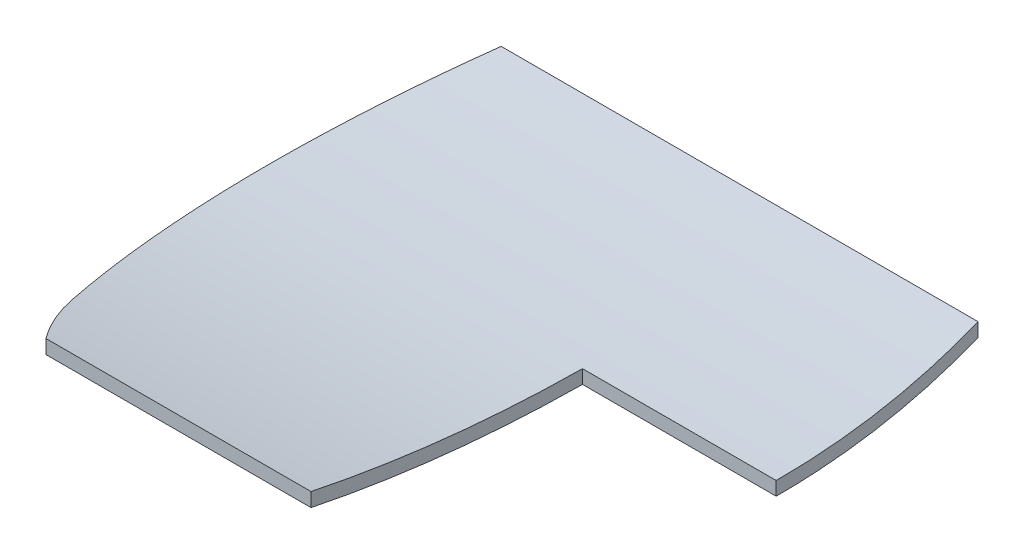
ISO-10303-21;
HEADER;
FILE_DESCRIPTION(('STEP AP214'),'2;1');
FILE_NAME('part.step','',(''),(''),'','','');
FILE_SCHEMA(('AUTOMOTIVE_DESIGN { 1 0 10303 214 1 1 1 1 }'));
ENDSEC;
DATA;
#1=APPLICATION_CONTEXT('core data for automotive mechanical design processes');
#2=APPLICATION_PROTOCOL_DEFINITION('international standard','automotive_design',2000,#1);
#3=PRODUCT_CONTEXT('',#1,'mechanical');
#4=PRODUCT('Part','Part','',(#3));
#5=PRODUCT_RELATED_PRODUCT_CATEGORY('part','',(#4));
#6=PRODUCT_DEFINITION_FORMATION('','',#4);
#7=PRODUCT_DEFINITION_CONTEXT('part definition',#1,'design');
#8=PRODUCT_DEFINITION('design','',#6,#7);
#9=PRODUCT_DEFINITION_SHAPE('','',#8);
#10=(LENGTH_UNIT() NAMED_UNIT(*) SI_UNIT(.MILLI.,.METRE.));
#11=(NAMED_UNIT(*) PLANE_ANGLE_UNIT() SI_UNIT($,.RADIAN.));
#12=(NAMED_UNIT(*) SI_UNIT($,.STERADIAN.) SOLID_ANGLE_UNIT());
#13=UNCERTAINTY_MEASURE_WITH_UNIT(LENGTH_MEASURE(1.E-05),#10,'distance_accuracy_value','');
#14=(GEOMETRIC_REPRESENTATION_CONTEXT(3) GLOBAL_UNCERTAINTY_ASSIGNED_CONTEXT((#13)) GLOBAL_UNIT_ASSIGNED_CONTEXT((#10,
#11,#12)) REPRESENTATION_CONTEXT('',''));
#15=CARTESIAN_POINT('',(0.,0.,0.));
#16=DIRECTION('',(0.,0.,1.));
#17=DIRECTION('',(1.,0.,0.));
#18=AXIS2_PLACEMENT_3D('',#15,#16,#17);
#19=CARTESIAN_POINT('',(-75.8377425044092,30.,71.3668430335097));
#20=DIRECTION('',(0.,0.,-1.));
#21=DIRECTION('',(-1.,0.,0.));
#22=AXIS2_PLACEMENT_3D('',#19,#20,#21);
#23=PLANE('',#22);
#24=DIRECTION('',(-1.,0.,0.));
#25=VECTOR('',#24,1.);
#26=CARTESIAN_POINT('',(20.7883417998944,4.41216156979368,71.3668430335097));
#27=LINE('',#26,#25);
#28=CARTESIAN_POINT('',(-25.2116582001055,4.41216156979368,71.3668430335097));
#29=VERTEX_POINT('',#28);
#30=CARTESIAN_POINT('',(-65.4037646343129,4.41216156979371,71.3668430335097));
#31=VERTEX_POINT('',#30);
#32=EDGE_CURVE('E62',#29,#31,#27,.T.);
#33=ORIENTED_EDGE('',*,*,#32,.F.);
#34=DIRECTION('',(0.,1.,0.));
#35=VECTOR('',#34,1.);
#36=CARTESIAN_POINT('',(-25.2116582001056,0.,71.3668430335097));
#37=LINE('',#36,#35);
#38=CARTESIAN_POINT('',(-25.2116582001055,6.52577837510951,71.3668430335097));
#39=VERTEX_POINT('',#38);
#40=EDGE_CURVE('E119',#29,#39,#37,.T.);
#41=ORIENTED_EDGE('',*,*,#40,.T.);
#42=DIRECTION('',(-1.,0.,0.));
#43=VECTOR('',#42,1.);
#44=CARTESIAN_POINT('',(20.7883417998944,6.52577837510951,71.3668430335097));
#45=LINE('',#44,#43);
#46=CARTESIAN_POINT('',(-65.4037646343129,6.52577837510951,71.3668430335097));
#47=VERTEX_POINT('',#46);
#48=EDGE_CURVE('E103',#39,#47,#45,.T.);
#49=ORIENTED_EDGE('',*,*,#48,.T.);
#50=DIRECTION('',(0.,1.,0.));
#51=VECTOR('',#50,1.);
#52=CARTESIAN_POINT('',(-65.4037646343129,0.,71.3668430335097));
#53=LINE('',#52,#51);
#54=EDGE_CURVE('E126',#31,#47,#53,.T.);
#55=ORIENTED_EDGE('',*,*,#54,.F.);
#56=EDGE_LOOP('',(#33,#41,#49,#55));
#57=FACE_BOUND('',#56,.T.);
#58=ADVANCED_FACE('F41',(#57),#23,.F.);
#59=CARTESIAN_POINT('',(-75.8377425044092,30.,-3.6331569664903));
#60=DIRECTION('',(0.,0.,1.));
#61=DIRECTION('',(1.,0.,0.));
#62=AXIS2_PLACEMENT_3D('',#59,#60,#61);
#63=PLANE('',#62);
#64=DIRECTION('',(-1.,0.,0.));
#65=VECTOR('',#64,1.);
#66=CARTESIAN_POINT('',(20.7883417998944,4.41216156979371,-3.6331569664903));
#67=LINE('',#66,#65);
#68=CARTESIAN_POINT('',(0.934093700573107,4.41216156979371,-3.6331569664903));
#69=VERTEX_POINT('',#68);
#70=CARTESIAN_POINT('',(-71.375833468403,4.41216156979371,-3.63315696649029));
#71=VERTEX_POINT('',#70);
#72=EDGE_CURVE('E173',#69,#71,#67,.T.);
#73=ORIENTED_EDGE('',*,*,#72,.F.);
#74=DIRECTION('',(0.,1.,0.));
#75=VECTOR('',#74,1.);
#76=CARTESIAN_POINT('',(0.934093700573027,0.,-3.6331569664903));
#77=LINE('',#76,#75);
#78=CARTESIAN_POINT('',(0.934093700573013,2.31945288912139,-3.6331569664903));
#79=VERTEX_POINT('',#78);
#80=EDGE_CURVE('E139',#79,#69,#77,.T.);
#81=ORIENTED_EDGE('',*,*,#80,.F.);
#82=DIRECTION('',(-1.,0.,0.));
#83=VECTOR('',#82,1.);
#84=CARTESIAN_POINT('',(20.7883417998944,2.31945288912139,-3.63315696649031));
#85=LINE('',#84,#83);
#86=CARTESIAN_POINT('',(-71.375833468403,2.31945288912139,-3.63315696649029));
#87=VERTEX_POINT('',#86);
#88=EDGE_CURVE('E214',#79,#87,#85,.T.);
#89=ORIENTED_EDGE('',*,*,#88,.T.);
#90=DIRECTION('',(0.,1.,0.));
#91=VECTOR('',#90,1.);
#92=CARTESIAN_POINT('',(-71.375833468403,0.,-3.6331569664903));
#93=LINE('',#92,#91);
#94=EDGE_CURVE('E143',#87,#71,#93,.T.);
#95=ORIENTED_EDGE('',*,*,#94,.T.);
#96=EDGE_LOOP('',(#73,#81,#89,#95));
#97=FACE_BOUND('',#96,.T.);
#98=ADVANCED_FACE('F189',(#97),#63,.F.);
#99=CARTESIAN_POINT('',(-192.882196536429,0.,31.9303002667312));
#100=DIRECTION('',(0.,1.,0.));
#101=DIRECTION('',(0.,0.,1.));
#102=AXIS2_PLACEMENT_3D('',#99,#100,#101);
#103=CYLINDRICAL_SURFACE('',#102,197.052058734775);
#104=CARTESIAN_POINT('',(4.16225749559082,2.08200439865197,30.1991195031464));
#105=CARTESIAN_POINT('',(4.1497500521118,2.06690595253031,28.7742096374881));
#106=CARTESIAN_POINT('',(4.12176267635813,2.06607037796173,27.3492867007925));
#107=CARTESIAN_POINT('',(4.0349017722859,2.09283816336801,24.5006582465492));
#108=CARTESIAN_POINT('',(3.97602843414067,2.12044134823864,23.0769527215596));
#109=CARTESIAN_POINT('',(3.827719864576,2.20385865025037,20.2367861368775));
#110=CARTESIAN_POINT('',(3.73838845405387,2.25957723749714,18.8203168443086));
#111=CARTESIAN_POINT('',(3.52927211708455,2.39900919013379,15.9910114980162));
#112=CARTESIAN_POINT('',(3.40948722092667,2.48272252767988,14.5781754406804));
#113=CARTESIAN_POINT('',(3.13967307331135,2.67791962083178,11.757350130364));
#114=CARTESIAN_POINT('',(2.98964445851893,2.78940279186235,10.3493607759891));
#115=CARTESIAN_POINT('',(2.6596063165774,3.03985766837566,7.53934817011896));
#116=CARTESIAN_POINT('',(2.47959663413071,3.17882951624645,6.13732494956595));
#117=CARTESIAN_POINT('',(2.08925251778527,3.48444320566137,3.33563505731731));
#118=CARTESIAN_POINT('',(1.87881732558479,3.65117727535941,1.93599249714563));
#119=CARTESIAN_POINT('',(1.42846854166668,4.01157419255261,-0.855038770162124));
#120=CARTESIAN_POINT('',(1.18855538971274,4.20523663832542,-2.24642760010603));
#121=CARTESIAN_POINT('',(0.934093700573018,4.4121615697937,-3.6331569664903));
#122=B_SPLINE_CURVE_WITH_KNOTS('',3,(#104,#105,#106,#107,#108,#109,#110,#111,#112,#113,#114,
#115,#116,#117,#118,#119,#120,#121),.UNSPECIFIED.,.F.,.F.,(4,2,2,2,2,2,2,2,4),(0.,
4.27497605719888,8.54992579250758,12.8104470334673,17.0709640368935,21.3313913609072,
25.5918407540015,29.8667368888206,34.141569256814),.UNSPECIFIED.);
#123=CARTESIAN_POINT('',(4.16225749559082,2.082004398652,30.1991195031464));
#124=VERTEX_POINT('',#123);
#125=EDGE_CURVE('E146',#124,#69,#122,.T.);
#126=ORIENTED_EDGE('',*,*,#125,.F.);
#127=DIRECTION('',(0.,1.,0.));
#128=VECTOR('',#127,1.);
#129=CARTESIAN_POINT('',(4.16225749559082,0.,30.1991195031464));
#130=LINE('',#129,#128);
#131=CARTESIAN_POINT('',(4.16225749559082,0.0118739380604582,30.1991195031464));
#132=VERTEX_POINT('',#131);
#133=EDGE_CURVE('E132',#132,#124,#130,.T.);
#134=ORIENTED_EDGE('',*,*,#133,.F.);
#135=CARTESIAN_POINT('',(0.934093700573013,2.31945288912136,-3.6331569664903));
#136=CARTESIAN_POINT('',(1.18858752579876,2.11452876182205,-2.24625170457617));
#137=CARTESIAN_POINT('',(1.42852249697442,1.92274020665817,-0.854723428324354));
#138=CARTESIAN_POINT('',(1.87889965158828,1.56583249275251,1.93652175330643));
#139=CARTESIAN_POINT('',(2.08934140335574,1.40071372435155,3.33623877822585));
#140=CARTESIAN_POINT('',(2.47969457155032,1.09805770224319,6.13806205385209));
#141=CARTESIAN_POINT('',(2.65970591159156,0.960429895621489,7.54014458882327));
#142=CARTESIAN_POINT('',(2.98974043348824,0.712398865573475,10.3502295088094));
#143=CARTESIAN_POINT('',(3.13976376780559,0.601995503734775,11.7582318636903));
#144=CARTESIAN_POINT('',(3.40956410916235,0.408690407431087,14.579045776477));
#145=CARTESIAN_POINT('',(3.52934049155992,0.325789240913785,15.9918574330912));
#146=CARTESIAN_POINT('',(3.73843954202594,0.187711180828256,18.821087262448));
#147=CARTESIAN_POINT('',(3.82776218030641,0.132534314378224,20.237505438717));
#148=CARTESIAN_POINT('',(3.97605286331917,0.0499305441751372,23.077511944083));
#149=CARTESIAN_POINT('',(4.0349179916723,0.0225974273916232,24.5011083804206));
#150=CARTESIAN_POINT('',(4.12176708439733,-0.00390721356976788,27.3495131167224));
#151=CARTESIAN_POINT('',(4.14975086228322,-0.00307856768561422,28.7743214239528));
#152=CARTESIAN_POINT('',(4.16225749559082,0.0118739380604467,30.1991195031464));
#153=B_SPLINE_CURVE_WITH_KNOTS('',3,(#135,#136,#137,#138,#139,#140,#141,#142,#143,#144,#145,
#146,#147,#148,#149,#150,#151,#152),.UNSPECIFIED.,.F.,.F.,(4,2,2,2,2,2,2,2,4),(0.,
4.27449659658858,8.54905574933461,12.8092938557696,17.0695103021899,21.3298147208411,
25.5901233066505,29.8647350409818,34.1393725886576),.UNSPECIFIED.);
#154=EDGE_CURVE('E175',#79,#132,#153,.T.);
#155=ORIENTED_EDGE('',*,*,#154,.F.);
#156=ORIENTED_EDGE('',*,*,#80,.T.);
#157=EDGE_LOOP('',(#126,#134,#155,#156));
#158=FACE_BOUND('',#157,.T.);
#159=ADVANCED_FACE('F186',(#158),#103,.T.);
#160=CARTESIAN_POINT('',(4.16225749559083,0.,30.1991195031464));
#161=DIRECTION('',(0.,0.,-1.));
#162=DIRECTION('',(-1.,0.,0.));
#163=AXIS2_PLACEMENT_3D('',#160,#161,#162);
#164=PLANE('',#163);
#165=DIRECTION('',(-1.,0.,0.));
#166=VECTOR('',#165,1.);
#167=CARTESIAN_POINT('',(20.7883417998944,2.082004398652,30.1991195031464));
#168=LINE('',#167,#166);
#169=CARTESIAN_POINT('',(-25.2116582001056,2.08200439865197,30.1991195031464));
#170=VERTEX_POINT('',#169);
#171=EDGE_CURVE('E123',#170,#124,#168,.F.);
#172=ORIENTED_EDGE('',*,*,#171,.F.);
#173=DIRECTION('',(0.,1.,0.));
#174=VECTOR('',#173,1.);
#175=CARTESIAN_POINT('',(-25.2116582001056,0.,30.1991195031464));
#176=LINE('',#175,#174);
#177=CARTESIAN_POINT('',(-25.2116582001056,0.011873938060486,30.1991195031464));
#178=VERTEX_POINT('',#177);
#179=EDGE_CURVE('E121',#178,#170,#176,.T.);
#180=ORIENTED_EDGE('',*,*,#179,.F.);
#181=DIRECTION('',(-1.,0.,0.));
#182=VECTOR('',#181,1.);
#183=CARTESIAN_POINT('',(20.7883417998944,0.011873938060486,30.1991195031464));
#184=LINE('',#183,#182);
#185=EDGE_CURVE('E172',#132,#178,#184,.T.);
#186=ORIENTED_EDGE('',*,*,#185,.F.);
#187=ORIENTED_EDGE('',*,*,#133,.T.);
#188=EDGE_LOOP('',(#172,#180,#186,#187));
#189=FACE_BOUND('',#188,.T.);
#190=ADVANCED_FACE('F231',(#189),#164,.F.);
#191=CARTESIAN_POINT('',(-25.2116582001056,0.,30.1991195031464));
#192=DIRECTION('',(-1.,0.,0.));
#193=DIRECTION('',(0.,0.,1.));
#194=AXIS2_PLACEMENT_3D('',#191,#192,#193);
#195=PLANE('',#194);
#196=CARTESIAN_POINT('',(-25.2116582001056,215.975985985376,27.9344274777523));
#197=DIRECTION('',(-1.,0.,0.));
#198=DIRECTION('',(0.,0.,1.));
#199=AXIS2_PLACEMENT_3D('',#196,#197,#198);
#200=CIRCLE('',#199,213.905970437928);
#201=EDGE_CURVE('E106',#39,#170,#200,.F.);
#202=ORIENTED_EDGE('',*,*,#201,.F.);
#203=ORIENTED_EDGE('',*,*,#40,.F.);
#204=CARTESIAN_POINT('',(-25.2116582001056,215.975985985376,27.9344274777524));
#205=DIRECTION('',(-1.,0.,0.));
#206=DIRECTION('',(0.,0.,1.));
#207=AXIS2_PLACEMENT_3D('',#204,#205,#206);
#208=CIRCLE('',#207,215.975985985376);
#209=EDGE_CURVE('E198',#178,#29,#208,.T.);
#210=ORIENTED_EDGE('',*,*,#209,.F.);
#211=ORIENTED_EDGE('',*,*,#179,.T.);
#212=EDGE_LOOP('',(#202,#203,#210,#211));
#213=FACE_BOUND('',#212,.T.);
#214=ADVANCED_FACE('F117',(#213),#195,.F.);
#215=CARTESIAN_POINT('',(35.3142305767403,0.,27.5436189071597));
#216=DIRECTION('',(0.,1.,0.));
#217=DIRECTION('',(0.,0.,1.));
#218=AXIS2_PLACEMENT_3D('',#215,#216,#217);
#219=CYLINDRICAL_SURFACE('',#218,111.151973081149);
#220=CARTESIAN_POINT('',(-71.375833468403,4.41216156979371,-3.63315696649032));
#221=CARTESIAN_POINT('',(-71.7718356768491,4.20994320359344,-2.27808069271092));
#222=CARTESIAN_POINT('',(-72.1424664584692,4.01970838291034,-0.913773124952403));
#223=CARTESIAN_POINT('',(-72.8321023283764,3.66420253756482,1.83111192000715));
#224=CARTESIAN_POINT('',(-73.1511049672504,3.49893269735006,3.21169016581235));
#225=CARTESIAN_POINT('',(-73.7366101083321,3.19434889302429,5.98701358412026));
#226=CARTESIAN_POINT('',(-74.0031043290898,3.05503902341959,7.38176095491094));
#227=CARTESIAN_POINT('',(-74.4827687540332,2.80323896875314,10.1827769114246));
#228=CARTESIAN_POINT('',(-74.6959400612387,2.69074822892211,11.589045258207));
#229=CARTESIAN_POINT('',(-75.0631319412531,2.49602624168748,14.3712070164451));
#230=CARTESIAN_POINT('',(-75.2186386929934,2.41303740074008,15.7468513926519));
#231=CARTESIAN_POINT('',(-75.4782325013502,2.27352240335241,18.5043181635753));
#232=CARTESIAN_POINT('',(-75.582319846734,2.21699609830079,19.886140523553));
#233=CARTESIAN_POINT('',(-75.7387589126008,2.13073766320849,22.6533400463161));
#234=CARTESIAN_POINT('',(-75.7911183342032,2.10100154477228,24.0387166491553));
#235=CARTESIAN_POINT('',(-75.8439712778178,2.06847573700846,26.8107764298614));
#236=CARTESIAN_POINT('',(-75.8444647610654,2.0656860678206,28.1974596087041));
#237=CARTESIAN_POINT('',(-75.793437504555,2.08711866583166,30.977348478335));
#238=CARTESIAN_POINT('',(-75.7416285096781,2.11149070697851,32.3705477305125));
#239=CARTESIAN_POINT('',(-75.5857072947837,2.18732922066446,35.1532762751625));
#240=CARTESIAN_POINT('',(-75.4815950008745,2.23879573148142,36.5428055624476));
#241=CARTESIAN_POINT('',(-75.2213427128767,2.36851412247575,39.3159597562718));
#242=CARTESIAN_POINT('',(-75.0651940393014,2.44677047116405,40.6995836387906));
#243=CARTESIAN_POINT('',(-74.7013148633412,2.62958918834359,43.4582863202106));
#244=CARTESIAN_POINT('',(-74.4935840104175,2.73415173560481,44.8333650609762));
#245=CARTESIAN_POINT('',(-74.0203707524097,2.97235146219809,47.6122404502133));
#246=CARTESIAN_POINT('',(-73.7533921853131,3.1067418894543,49.0157178550419));
#247=CARTESIAN_POINT('',(-73.1661945959273,3.40187019887849,51.8087183772962));
#248=CARTESIAN_POINT('',(-72.8459743823786,3.56260867057185,53.1982411817557));
#249=CARTESIAN_POINT('',(-72.1532536477717,3.90941281638371,55.9606540595079));
#250=CARTESIAN_POINT('',(-71.7807647187261,4.09547287447516,57.3335477476205));
#251=CARTESIAN_POINT('',(-70.9844790591368,4.49179201047626,60.0607616948446));
#252=CARTESIAN_POINT('',(-70.5606850787666,4.70204979125317,61.4150829451906));
#253=CARTESIAN_POINT('',(-70.1117315459056,4.9238388191831,62.7590648129978));
#254=B_SPLINE_CURVE_WITH_KNOTS('',3,(#220,#221,#222,#223,#224,#225,#226,#227,#228,#229,#230,
#231,#232,#233,#234,#235,#236,#237,#238,#239,#240,#241,#242,#243,#244,#245,#246,#247,#248,#249,
#250,#251,#252,#253),.UNSPECIFIED.,.F.,.F.,(4,2,2,2,2,2,2,2,2,2,2,2,2,2,2,2,4),(0.,
4.27822531297612,8.55665353992923,12.8357560069159,17.1147699505005,21.2742356514809,
25.4336779929763,29.5925009941097,33.7513271035405,37.9331995995516,42.1150780035415,
46.2976542796777,50.4802589802649,54.7837995731152,59.0874364688529,63.3901204198611,
67.6925738303771),.UNSPECIFIED.);
#255=CARTESIAN_POINT('',(-70.1117315459056,4.92383881918312,62.7590648129978));
#256=VERTEX_POINT('',#255);
#257=EDGE_CURVE('E69',#71,#256,#254,.T.);
#258=ORIENTED_EDGE('',*,*,#257,.F.);
#259=ORIENTED_EDGE('',*,*,#94,.F.);
#260=CARTESIAN_POINT('',(-70.1117315459056,2.82610642448117,62.7590648129978));
#261=CARTESIAN_POINT('',(-70.5597428054442,2.60696106853923,61.4179027914998));
#262=CARTESIAN_POINT('',(-70.9826890014258,2.39918428385587,60.0664791596287));
#263=CARTESIAN_POINT('',(-71.7774823138219,2.0074838241554,57.345200187137));
#264=CARTESIAN_POINT('',(-72.1493267600739,1.82356139560147,55.9753438874779));
#265=CARTESIAN_POINT('',(-72.840974312456,1.48067220624252,53.2191379533515));
#266=CARTESIAN_POINT('',(-73.1607663097727,1.32171077276225,51.8327848657776));
#267=CARTESIAN_POINT('',(-73.7473405246304,1.02975798698991,49.0462215034852));
#268=CARTESIAN_POINT('',(-74.014123899226,0.896766067845012,47.6460115319307));
#269=CARTESIAN_POINT('',(-74.487232607224,0.660918157913831,44.8734193352934));
#270=CARTESIAN_POINT('',(-74.6950386906047,0.55732408077175,43.5013524632385));
#271=CARTESIAN_POINT('',(-75.0592893469193,0.376071963814204,40.7487162788918));
#272=CARTESIAN_POINT('',(-75.2157342609169,0.298413751771647,39.368147023122));
#273=CARTESIAN_POINT('',(-75.4768061247751,0.169514601463559,36.6011107386276));
#274=CARTESIAN_POINT('',(-75.5814413928372,0.118269422448384,35.2146446927267));
#275=CARTESIAN_POINT('',(-75.7386369430133,0.0424942152396946,32.4380337379475));
#276=CARTESIAN_POINT('',(-75.7911972554508,0.0179641714898842,31.0478888312118));
#277=CARTESIAN_POINT('',(-75.844063816755,-0.0042093312337029,28.2680916573916));
#278=CARTESIAN_POINT('',(-75.8444338752694,-0.00188562631180997,26.8784408660595));
#279=CARTESIAN_POINT('',(-75.7930843884308,0.0295657193847608,24.1004063811794));
#280=CARTESIAN_POINT('',(-75.7413648415116,0.0586933609654385,22.7120226876694));
#281=CARTESIAN_POINT('',(-75.5859791193872,0.143595299677073,19.9387745022566));
#282=CARTESIAN_POINT('',(-75.4823051584989,0.199373590510693,18.5539105690825));
#283=CARTESIAN_POINT('',(-75.2233086764909,0.337256419501832,15.7903349748607));
#284=CARTESIAN_POINT('',(-75.0679858672396,0.419361104525387,14.4116233481782));
#285=CARTESIAN_POINT('',(-74.7009407188775,0.612149996863956,11.6232903579009));
#286=CARTESIAN_POINT('',(-74.4877281099453,0.723586577034852,10.2139170499468));
#287=CARTESIAN_POINT('',(-74.0077375028837,0.973139256772535,7.40667963056611));
#288=CARTESIAN_POINT('',(-73.7409584023776,1.11125590540213,6.00881575661532));
#289=CARTESIAN_POINT('',(-73.1546367081772,1.41331868048193,3.22725602756486));
#290=CARTESIAN_POINT('',(-72.8351023742946,1.57726076329667,1.84355799050064));
#291=CARTESIAN_POINT('',(-72.1441539510817,1.92998029294928,-0.907558784037952));
#292=CARTESIAN_POINT('',(-71.7727422958008,2.11875657455886,-2.27497828202579));
#293=CARTESIAN_POINT('',(-71.375833468403,2.31945288912137,-3.63315696649026));
#294=B_SPLINE_CURVE_WITH_KNOTS('',3,(#260,#261,#262,#263,#264,#265,#266,#267,#268,#269,#270,
#271,#272,#273,#274,#275,#276,#277,#278,#279,#280,#281,#282,#283,#284,#285,#286,#287,#288,#289,
#290,#291,#292,#293),.UNSPECIFIED.,.F.,.F.,(4,2,2,2,2,2,2,2,2,2,2,2,2,2,2,2,4),(0.,
4.29242132881403,8.58506685950385,12.8786273106643,17.1720940331173,21.3456187287484,
25.5191157095409,29.6919424048227,33.8647666702549,38.0324890490918,42.2002115532531,
46.3685588026937,50.5369293063365,54.8248917654901,59.1129424782244,63.4003224525382,
67.6875013333574),.UNSPECIFIED.);
#295=CARTESIAN_POINT('',(-70.1117315459056,2.82610642448117,62.7590648129978));
#296=VERTEX_POINT('',#295);
#297=EDGE_CURVE('E164',#296,#87,#294,.T.);
#298=ORIENTED_EDGE('',*,*,#297,.F.);
#299=DIRECTION('',(0.,1.,0.));
#300=VECTOR('',#299,1.);
#301=CARTESIAN_POINT('',(-70.1117315459056,0.,62.7590648129978));
#302=LINE('',#301,#300);
#303=EDGE_CURVE('E130',#296,#256,#302,.T.);
#304=ORIENTED_EDGE('',*,*,#303,.T.);
#305=EDGE_LOOP('',(#258,#259,#298,#304));
#306=FACE_BOUND('',#305,.T.);
#307=ADVANCED_FACE('F182',(#306),#219,.T.);
#308=CARTESIAN_POINT('',(-43.8504001530217,0.,53.9869893539611));
#309=DIRECTION('',(0.,1.,0.));
#310=DIRECTION('',(0.,0.,1.));
#311=AXIS2_PLACEMENT_3D('',#308,#309,#310);
#312=CYLINDRICAL_SURFACE('',#311,27.6876657446218);
#313=CARTESIAN_POINT('',(-70.1117315459056,4.92383881918312,62.7590648129978));
#314=CARTESIAN_POINT('',(-69.9808942088315,4.98846855263023,63.150758174987));
#315=CARTESIAN_POINT('',(-69.8413395870423,5.05371555353886,63.5393830937628));
#316=CARTESIAN_POINT('',(-69.5450629868339,5.18522426311164,64.3098529899614));
#317=CARTESIAN_POINT('',(-69.3883412129959,5.25148595967554,64.6916980481168));
#318=CARTESIAN_POINT('',(-68.8954310346522,5.4504123424743,65.8201374702124));
#319=CARTESIAN_POINT('',(-68.5344198159401,5.58424660475027,66.5558447607433));
#320=CARTESIAN_POINT('',(-67.748732304272,5.85299604645236,67.9922271537016));
#321=CARTESIAN_POINT('',(-67.3240562095425,5.98791122251171,68.6929023651957));
#322=CARTESIAN_POINT('',(-66.6400485572189,6.18998179069702,69.7162297654511));
#323=CARTESIAN_POINT('',(-66.4031877330729,6.25755357938415,70.0539984740073));
#324=CARTESIAN_POINT('',(-65.9145580253018,6.39214626314737,70.7186923434902));
#325=CARTESIAN_POINT('',(-65.6627890215213,6.45916715377843,71.0456174169873));
#326=CARTESIAN_POINT('',(-65.4037646343129,6.52577837510955,71.3668430335097));
#327=B_SPLINE_CURVE_WITH_KNOTS('',3,(#313,#314,#315,#316,#317,#318,#319,#320,#321,#322,#323,
#324,#325,#326),.UNSPECIFIED.,.F.,.F.,(4,2,2,2,2,2,4),(0.,1.25377815917666,2.50754137868029,
4.99525596728622,7.48296281031687,8.73672322527825,9.99049374655001),.UNSPECIFIED.);
#328=EDGE_CURVE('E11',#256,#47,#327,.T.);
#329=ORIENTED_EDGE('',*,*,#328,.F.);
#330=ORIENTED_EDGE('',*,*,#303,.F.);
#331=CARTESIAN_POINT('',(-65.4037646343129,4.41216156979365,71.3668430335097));
#332=CARTESIAN_POINT('',(-65.662789243032,4.34621577574481,71.0456171732205));
#333=CARTESIAN_POINT('',(-65.9145591744599,4.27986357942155,70.7186908901323));
#334=CARTESIAN_POINT('',(-66.4031914986779,4.14661225134268,70.0539932416835));
#335=CARTESIAN_POINT('',(-66.6400540111737,4.07971312398379,69.7162219634406));
#336=CARTESIAN_POINT('',(-67.3240650258259,3.87965255187214,68.6928884663143));
#337=CARTESIAN_POINT('',(-67.7487431741484,3.74607679273249,67.9922087606375));
#338=CARTESIAN_POINT('',(-68.534432065047,3.47999114221741,66.5558208879905));
#339=CARTESIAN_POINT('',(-68.8954426140288,3.34748125408415,65.8201126145175));
#340=CARTESIAN_POINT('',(-69.388349739128,3.15052074932434,64.6916776951124));
#341=CARTESIAN_POINT('',(-69.5450704054156,3.08491330337141,64.3098343729352));
#342=CARTESIAN_POINT('',(-69.8413439060556,2.9547024058297,63.5393711871493));
#343=CARTESIAN_POINT('',(-69.980896537882,2.89009896609273,63.1507512436605));
#344=CARTESIAN_POINT('',(-70.1117315459056,2.82610642448117,62.7590648129978));
#345=B_SPLINE_CURVE_WITH_KNOTS('',3,(#331,#332,#333,#334,#335,#336,#337,#338,#339,#340,#341,
#342,#343,#344),.UNSPECIFIED.,.F.,.F.,(4,2,2,2,2,2,4),(0.,1.25345488371715,2.50689970096512,
4.99397039890567,7.48104865915748,8.73449621415418,9.98795855426886),.UNSPECIFIED.);
#346=EDGE_CURVE('E55',#31,#296,#345,.T.);
#347=ORIENTED_EDGE('',*,*,#346,.F.);
#348=ORIENTED_EDGE('',*,*,#54,.T.);
#349=EDGE_LOOP('',(#329,#330,#347,#348));
#350=FACE_BOUND('',#349,.T.);
#351=ADVANCED_FACE('F153',(#350),#312,.T.);
#352=CARTESIAN_POINT('',(20.7883417998944,215.975985985376,27.9344274777523));
#353=DIRECTION('',(-1.,0.,0.));
#354=DIRECTION('',(0.,0.,1.));
#355=AXIS2_PLACEMENT_3D('',#352,#353,#354);
#356=CYLINDRICAL_SURFACE('',#355,215.975985985376);
#357=ORIENTED_EDGE('',*,*,#154,.T.);
#358=ORIENTED_EDGE('',*,*,#185,.T.);
#359=ORIENTED_EDGE('',*,*,#209,.T.);
#360=ORIENTED_EDGE('',*,*,#32,.T.);
#361=ORIENTED_EDGE('',*,*,#346,.T.);
#362=ORIENTED_EDGE('',*,*,#297,.T.);
#363=ORIENTED_EDGE('',*,*,#88,.F.);
#364=EDGE_LOOP('',(#357,#358,#359,#360,#361,#362,#363));
#365=FACE_BOUND('',#364,.T.);
#366=ADVANCED_FACE('F156',(#365),#356,.T.);
#367=CARTESIAN_POINT('',(20.7883417998944,215.975985985376,27.9344274777523));
#368=DIRECTION('',(-1.,0.,0.));
#369=DIRECTION('',(0.,0.,1.));
#370=AXIS2_PLACEMENT_3D('',#367,#368,#369);
#371=CYLINDRICAL_SURFACE('',#370,213.905970437928);
#372=ORIENTED_EDGE('',*,*,#125,.T.);
#373=ORIENTED_EDGE('',*,*,#72,.T.);
#374=ORIENTED_EDGE('',*,*,#257,.T.);
#375=ORIENTED_EDGE('',*,*,#328,.T.);
#376=ORIENTED_EDGE('',*,*,#48,.F.);
#377=ORIENTED_EDGE('',*,*,#201,.T.);
#378=ORIENTED_EDGE('',*,*,#171,.T.);
#379=EDGE_LOOP('',(#372,#373,#374,#375,#376,#377,#378));
#380=FACE_BOUND('',#379,.T.);
#381=ADVANCED_FACE('F105',(#380),#371,.F.);
#382=CLOSED_SHELL('',(#58,#98,#159,#190,#214,#307,#351,#366,#381));
#383=MANIFOLD_SOLID_BREP('B2',#382);
#384=ADVANCED_BREP_SHAPE_REPRESENTATION('',(#18,#383),#14);
#385=SHAPE_DEFINITION_REPRESENTATION(#9,#384);
ENDSEC;
END-ISO-10303-21;
